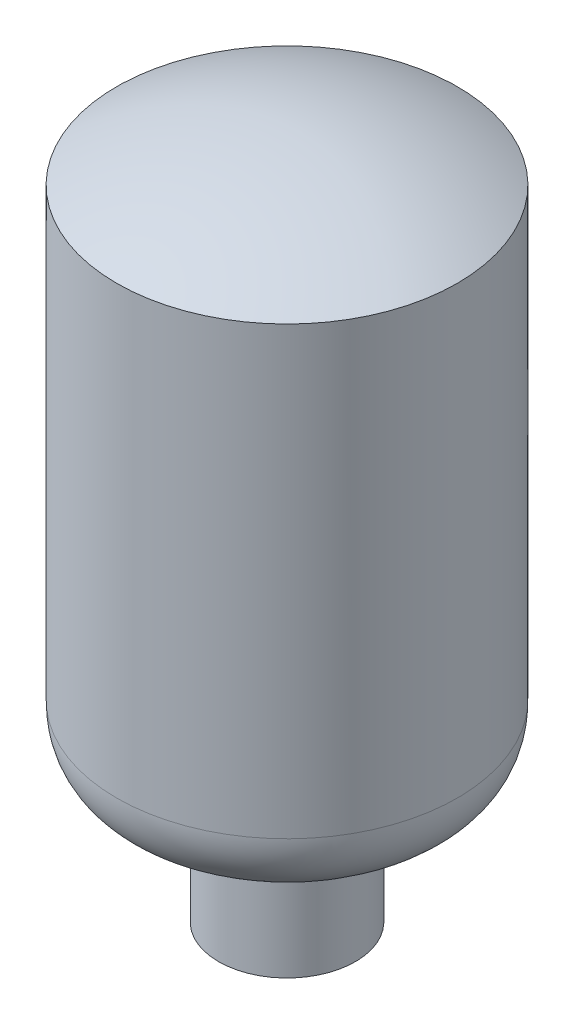
ISO-10303-21;
HEADER;
FILE_DESCRIPTION(('STEP AP214'),'2;1');
FILE_NAME('part.step','',(''),(''),'','','');
FILE_SCHEMA(('AUTOMOTIVE_DESIGN { 1 0 10303 214 1 1 1 1 }'));
ENDSEC;
DATA;
#1=APPLICATION_CONTEXT('core data for automotive mechanical design processes');
#2=APPLICATION_PROTOCOL_DEFINITION('international standard','automotive_design',2000,#1);
#3=PRODUCT_CONTEXT('',#1,'mechanical');
#4=PRODUCT('Part','Part','',(#3));
#5=PRODUCT_RELATED_PRODUCT_CATEGORY('part','',(#4));
#6=PRODUCT_DEFINITION_FORMATION('','',#4);
#7=PRODUCT_DEFINITION_CONTEXT('part definition',#1,'design');
#8=PRODUCT_DEFINITION('design','',#6,#7);
#9=PRODUCT_DEFINITION_SHAPE('','',#8);
#10=(LENGTH_UNIT() NAMED_UNIT(*) SI_UNIT(.MILLI.,.METRE.));
#11=(NAMED_UNIT(*) PLANE_ANGLE_UNIT() SI_UNIT($,.RADIAN.));
#12=(NAMED_UNIT(*) SI_UNIT($,.STERADIAN.) SOLID_ANGLE_UNIT());
#13=UNCERTAINTY_MEASURE_WITH_UNIT(LENGTH_MEASURE(1.E-05),#10,'distance_accuracy_value','');
#14=(GEOMETRIC_REPRESENTATION_CONTEXT(3) GLOBAL_UNCERTAINTY_ASSIGNED_CONTEXT((#13)) GLOBAL_UNIT_ASSIGNED_CONTEXT((#10,
#11,#12)) REPRESENTATION_CONTEXT('',''));
#15=CARTESIAN_POINT('',(0.,0.,0.));
#16=DIRECTION('',(0.,0.,1.));
#17=DIRECTION('',(1.,0.,0.));
#18=AXIS2_PLACEMENT_3D('',#15,#16,#17);
#19=CARTESIAN_POINT('',(0.,28.,0.));
#20=DIRECTION('',(0.,-1.,0.));
#21=DIRECTION('',(0.,0.,-1.));
#22=AXIS2_PLACEMENT_3D('',#19,#20,#21);
#23=CYLINDRICAL_SURFACE('',#22,21.5);
#24=CARTESIAN_POINT('',(0.,28.,0.));
#25=DIRECTION('',(0.,1.,0.));
#26=DIRECTION('',(0.,0.,1.));
#27=AXIS2_PLACEMENT_3D('',#24,#25,#26);
#28=CIRCLE('',#27,21.5);
#29=CARTESIAN_POINT('',(0.,28.,21.5));
#30=VERTEX_POINT('',#29);
#31=EDGE_CURVE('E11',#30,#30,#28,.T.);
#32=ORIENTED_EDGE('',*,*,#31,.F.);
#33=EDGE_LOOP('',(#32));
#34=FACE_BOUND('',#33,.T.);
#35=CARTESIAN_POINT('',(0.,0.,0.));
#36=DIRECTION('',(0.,1.,0.));
#37=DIRECTION('',(0.,0.,1.));
#38=AXIS2_PLACEMENT_3D('',#35,#36,#37);
#39=CIRCLE('',#38,21.5);
#40=CARTESIAN_POINT('',(0.,0.,21.5));
#41=VERTEX_POINT('',#40);
#42=EDGE_CURVE('E45',#41,#41,#39,.T.);
#43=ORIENTED_EDGE('',*,*,#42,.T.);
#44=EDGE_LOOP('',(#43));
#45=FACE_BOUND('',#44,.T.);
#46=ADVANCED_FACE('F42',(#34,#45),#23,.T.);
#47=CARTESIAN_POINT('',(0.,0.,0.));
#48=DIRECTION('',(0.,1.,0.));
#49=DIRECTION('',(0.,0.,1.));
#50=AXIS2_PLACEMENT_3D('',#47,#48,#49);
#51=PLANE('',#50);
#52=CARTESIAN_POINT('',(0.,0.,0.));
#53=DIRECTION('',(0.,1.,0.));
#54=DIRECTION('',(0.,0.,1.));
#55=AXIS2_PLACEMENT_3D('',#52,#53,#54);
#56=CIRCLE('',#55,20.);
#57=CARTESIAN_POINT('',(0.,0.,20.));
#58=VERTEX_POINT('',#57);
#59=EDGE_CURVE('E71',#58,#58,#56,.T.);
#60=ORIENTED_EDGE('',*,*,#59,.T.);
#61=EDGE_LOOP('',(#60));
#62=FACE_BOUND('',#61,.T.);
#63=ORIENTED_EDGE('',*,*,#42,.F.);
#64=EDGE_LOOP('',(#63));
#65=FACE_BOUND('',#64,.T.);
#66=ADVANCED_FACE('F139',(#62,#65),#51,.F.);
#67=CARTESIAN_POINT('',(0.,28.,0.));
#68=DIRECTION('',(0.,1.,0.));
#69=DIRECTION('',(0.,0.,1.));
#70=AXIS2_PLACEMENT_3D('',#67,#68,#69);
#71=CONICAL_SURFACE('',#70,21.5,0.722734247813415);
#72=CARTESIAN_POINT('',(0.,34.,0.));
#73=DIRECTION('',(0.,1.,0.));
#74=DIRECTION('',(0.,0.,1.));
#75=AXIS2_PLACEMENT_3D('',#72,#73,#74);
#76=CIRCLE('',#75,26.7915026221292);
#77=CARTESIAN_POINT('',(0.,34.,26.7915026221292));
#78=VERTEX_POINT('',#77);
#79=EDGE_CURVE('E131',#78,#78,#76,.T.);
#80=ORIENTED_EDGE('',*,*,#79,.F.);
#81=EDGE_LOOP('',(#80));
#82=FACE_BOUND('',#81,.T.);
#83=ORIENTED_EDGE('',*,*,#31,.T.);
#84=EDGE_LOOP('',(#83));
#85=FACE_BOUND('',#84,.T.);
#86=ADVANCED_FACE('F94',(#82,#85),#71,.T.);
#87=CARTESIAN_POINT('',(26.3509179910604,33.883645720053,0.));
#88=CARTESIAN_POINT('',(26.5712103065948,33.9418228600265,0.));
#89=CARTESIAN_POINT('',(26.7915026221292,34.,0.));
#90=CARTESIAN_POINT('',(31.5,35.2434701153906,0.));
#91=CARTESIAN_POINT('',(31.5,38.5,0.));
#92=CARTESIAN_POINT('',(31.5,39.2508613442087,0.));
#93=CARTESIAN_POINT('',(31.5,40.0017226884173,0.));
#94=B_SPLINE_CURVE_WITH_KNOTS('',2,(#87,#88,#89,#90,#91,#92,#93),.UNSPECIFIED.,.F.,.F.,(3,2,2,
3),(-0.046786118342066,0.,1.,1.23057099760002),.UNSPECIFIED.);
#95=CARTESIAN_POINT('',(0.,200.5,0.));
#96=DIRECTION('',(0.,1.,0.));
#97=AXIS1_PLACEMENT('',#95,#96);
#98=SURFACE_OF_REVOLUTION('',#94,#97);
#99=CARTESIAN_POINT('',(0.,38.5,0.));
#100=DIRECTION('',(0.,1.,0.));
#101=DIRECTION('',(0.,0.,1.));
#102=AXIS2_PLACEMENT_3D('',#99,#100,#101);
#103=CIRCLE('',#102,31.5);
#104=CARTESIAN_POINT('',(0.,38.5,31.5));
#105=VERTEX_POINT('',#104);
#106=EDGE_CURVE('E128',#105,#105,#103,.T.);
#107=ORIENTED_EDGE('',*,*,#106,.F.);
#108=EDGE_LOOP('',(#107));
#109=FACE_BOUND('',#108,.T.);
#110=ORIENTED_EDGE('',*,*,#79,.T.);
#111=EDGE_LOOP('',(#110));
#112=FACE_BOUND('',#111,.T.);
#113=ADVANCED_FACE('F88',(#109,#112),#98,.T.);
#114=CARTESIAN_POINT('',(29.9982783008005,38.5017236765004,0.));
#115=CARTESIAN_POINT('',(30.4988522005336,38.5011491176669,0.));
#116=CARTESIAN_POINT('',(30.9994261002668,38.5005745588335,0.));
#117=CARTESIAN_POINT('',(31.5,38.5,0.));
#118=CARTESIAN_POINT('',(41.8708926258628,38.4880962871371,0.));
#119=CARTESIAN_POINT('',(53.5,45.2057493483189,0.));
#120=CARTESIAN_POINT('',(53.5,60.5,0.));
#121=B_SPLINE_CURVE_WITH_KNOTS('',3,(#114,#115,#116,#117,#118,#119,#120),.UNSPECIFIED.,.F.,.F.,
(4,3,4),(-0.0482671952928001,0.,1.),.UNSPECIFIED.);
#122=CARTESIAN_POINT('',(0.,200.5,0.));
#123=DIRECTION('',(0.,1.,0.));
#124=AXIS1_PLACEMENT('',#122,#123);
#125=SURFACE_OF_REVOLUTION('',#121,#124);
#126=CARTESIAN_POINT('',(0.,60.5,0.));
#127=DIRECTION('',(0.,1.,0.));
#128=DIRECTION('',(0.,0.,1.));
#129=AXIS2_PLACEMENT_3D('',#126,#127,#128);
#130=CIRCLE('',#129,53.5);
#131=CARTESIAN_POINT('',(0.,60.5,53.5));
#132=VERTEX_POINT('',#131);
#133=EDGE_CURVE('E125',#132,#132,#130,.T.);
#134=ORIENTED_EDGE('',*,*,#133,.F.);
#135=EDGE_LOOP('',(#134));
#136=FACE_BOUND('',#135,.T.);
#137=ORIENTED_EDGE('',*,*,#106,.T.);
#138=EDGE_LOOP('',(#137));
#139=FACE_BOUND('',#138,.T.);
#140=ADVANCED_FACE('F93',(#136,#139),#125,.T.);
#141=CARTESIAN_POINT('',(0.,200.5,0.));
#142=DIRECTION('',(0.,1.,0.));
#143=DIRECTION('',(0.,0.,1.));
#144=AXIS2_PLACEMENT_3D('',#141,#142,#143);
#145=CYLINDRICAL_SURFACE('',#144,53.5);
#146=CARTESIAN_POINT('',(0.,200.5,0.));
#147=DIRECTION('',(0.,1.,0.));
#148=DIRECTION('',(0.,0.,1.));
#149=AXIS2_PLACEMENT_3D('',#146,#147,#148);
#150=CIRCLE('',#149,53.5);
#151=CARTESIAN_POINT('',(0.,200.5,53.5));
#152=VERTEX_POINT('',#151);
#153=EDGE_CURVE('E119',#152,#152,#150,.T.);
#154=ORIENTED_EDGE('',*,*,#153,.F.);
#155=EDGE_LOOP('',(#154));
#156=FACE_BOUND('',#155,.T.);
#157=ORIENTED_EDGE('',*,*,#133,.T.);
#158=EDGE_LOOP('',(#157));
#159=FACE_BOUND('',#158,.T.);
#160=ADVANCED_FACE('F105',(#156,#159),#145,.T.);
#161=CARTESIAN_POINT('',(53.5,200.5,0.));
#162=CARTESIAN_POINT('',(27.6507233178447,214.5,0.));
#163=CARTESIAN_POINT('',(0.,214.5,0.));
#164=B_SPLINE_CURVE_WITH_KNOTS('',2,(#161,#162,#163),.UNSPECIFIED.,.F.,.F.,(3,3),(0.,1.),.UNSPECIFIED.);
#165=CARTESIAN_POINT('',(0.,214.5,0.));
#166=DIRECTION('',(0.,1.,0.));
#167=AXIS1_PLACEMENT('',#165,#166);
#168=SURFACE_OF_REVOLUTION('',#164,#167);
#169=CARTESIAN_POINT('',(0.,214.5,0.));
#170=VERTEX_POINT('',#169);
#171=VERTEX_LOOP('',#170);
#172=FACE_BOUND('',#171,.T.);
#173=ORIENTED_EDGE('',*,*,#153,.T.);
#174=EDGE_LOOP('',(#173));
#175=FACE_BOUND('',#174,.T.);
#176=ADVANCED_FACE('F109',(#172,#175),#168,.T.);
#177=CARTESIAN_POINT('',(0.,28.,0.));
#178=DIRECTION('',(0.,-1.,0.));
#179=DIRECTION('',(0.,0.,-1.));
#180=AXIS2_PLACEMENT_3D('',#177,#178,#179);
#181=CYLINDRICAL_SURFACE('',#180,20.);
#182=CARTESIAN_POINT('',(0.,28.5669467095138,0.));
#183=DIRECTION('',(0.,1.,0.));
#184=DIRECTION('',(0.,0.,1.));
#185=AXIS2_PLACEMENT_3D('',#182,#183,#184);
#186=CIRCLE('',#185,20.);
#187=CARTESIAN_POINT('',(0.,28.5669467095138,20.));
#188=VERTEX_POINT('',#187);
#189=EDGE_CURVE('E74',#188,#188,#186,.T.);
#190=ORIENTED_EDGE('',*,*,#189,.T.);
#191=EDGE_LOOP('',(#190));
#192=FACE_BOUND('',#191,.T.);
#193=ORIENTED_EDGE('',*,*,#59,.F.);
#194=EDGE_LOOP('',(#193));
#195=FACE_BOUND('',#194,.T.);
#196=ADVANCED_FACE('F113',(#192,#195),#181,.F.);
#197=CARTESIAN_POINT('',(0.,28.9921567416492,0.));
#198=DIRECTION('',(0.,1.,0.));
#199=DIRECTION('',(0.,0.,1.));
#200=AXIS2_PLACEMENT_3D('',#197,#198,#199);
#201=CONICAL_SURFACE('',#200,20.375,0.722734247813415);
#202=CARTESIAN_POINT('',(0.,35.3339240437317,0.));
#203=DIRECTION('',(0.,1.,0.));
#204=DIRECTION('',(0.,0.,1.));
#205=AXIS2_PLACEMENT_3D('',#202,#203,#204);
#206=CIRCLE('',#205,25.9679130513171);
#207=CARTESIAN_POINT('',(0.,35.3339240437317,25.9679130513171));
#208=VERTEX_POINT('',#207);
#209=EDGE_CURVE('E75',#208,#208,#206,.T.);
#210=ORIENTED_EDGE('',*,*,#209,.T.);
#211=EDGE_LOOP('',(#210));
#212=FACE_BOUND('',#211,.T.);
#213=ORIENTED_EDGE('',*,*,#189,.F.);
#214=EDGE_LOOP('',(#213));
#215=FACE_BOUND('',#214,.T.);
#216=ADVANCED_FACE('F151',(#212,#215),#201,.F.);
#217=CARTESIAN_POINT('',(26.3509179910604,33.883645720053,0.));
#218=CARTESIAN_POINT('',(26.5712103065948,33.9418228600265,0.));
#219=CARTESIAN_POINT('',(31.5,35.2434701153906,0.));
#220=CARTESIAN_POINT('',(31.5,39.2508613442087,0.));
#221=CARTESIAN_POINT('',(31.5,40.0017226884173,0.));
#222=B_SPLINE_CURVE_WITH_KNOTS('',2,(#217,#218,#219,#220,#221),.UNSPECIFIED.,.F.,.F.,(3,1,1,3),
(-0.046786118342066,0.,1.,1.23057099760002),.UNSPECIFIED.);
#223=CARTESIAN_POINT('',(0.,200.5,0.));
#224=DIRECTION('',(0.,1.,0.));
#225=AXIS1_PLACEMENT('',#223,#224);
#226=SURFACE_OF_REVOLUTION('',#222,#225);
#227=OFFSET_SURFACE('',#226,-1.5,.F.);
#228=CARTESIAN_POINT('',(0.,40.0017226884173,0.));
#229=DIRECTION('',(0.,1.,0.));
#230=DIRECTION('',(0.,0.,1.));
#231=AXIS2_PLACEMENT_3D('',#228,#229,#230);
#232=CIRCLE('',#231,30.);
#233=CARTESIAN_POINT('',(0.,40.0017226884173,30.));
#234=VERTEX_POINT('',#233);
#235=EDGE_CURVE('E67',#234,#234,#232,.T.);
#236=ORIENTED_EDGE('',*,*,#235,.T.);
#237=EDGE_LOOP('',(#236));
#238=FACE_BOUND('',#237,.T.);
#239=ORIENTED_EDGE('',*,*,#209,.F.);
#240=EDGE_LOOP('',(#239));
#241=FACE_BOUND('',#240,.T.);
#242=ADVANCED_FACE('F96',(#238,#241),#227,.F.);
#243=CARTESIAN_POINT('',(29.9982783008005,38.5017236765004,0.));
#244=CARTESIAN_POINT('',(30.4988522005336,38.5011491176669,0.));
#245=CARTESIAN_POINT('',(30.9994261002668,38.5005745588335,0.));
#246=CARTESIAN_POINT('',(41.8708926258628,38.4880962871371,0.));
#247=CARTESIAN_POINT('',(53.5,45.2057493483189,0.));
#248=CARTESIAN_POINT('',(53.5,60.5,0.));
#249=B_SPLINE_CURVE_WITH_KNOTS('',3,(#243,#244,#245,#246,#247,#248),.UNSPECIFIED.,.F.,.F.,(4,2,
4),(-0.0482671952928001,0.,1.),.UNSPECIFIED.);
#250=CARTESIAN_POINT('',(0.,200.5,0.));
#251=DIRECTION('',(0.,1.,0.));
#252=AXIS1_PLACEMENT('',#250,#251);
#253=SURFACE_OF_REVOLUTION('',#249,#252);
#254=OFFSET_SURFACE('',#253,-1.5,.F.);
#255=CARTESIAN_POINT('',(0.,60.5,0.));
#256=DIRECTION('',(0.,1.,0.));
#257=DIRECTION('',(0.,0.,1.));
#258=AXIS2_PLACEMENT_3D('',#255,#256,#257);
#259=CIRCLE('',#258,52.);
#260=CARTESIAN_POINT('',(0.,60.5,52.));
#261=VERTEX_POINT('',#260);
#262=EDGE_CURVE('E64',#261,#261,#259,.T.);
#263=ORIENTED_EDGE('',*,*,#262,.T.);
#264=EDGE_LOOP('',(#263));
#265=FACE_BOUND('',#264,.T.);
#266=ORIENTED_EDGE('',*,*,#235,.F.);
#267=EDGE_LOOP('',(#266));
#268=FACE_BOUND('',#267,.T.);
#269=ADVANCED_FACE('F98',(#265,#268),#254,.F.);
#270=CARTESIAN_POINT('',(0.,200.5,0.));
#271=DIRECTION('',(0.,1.,0.));
#272=DIRECTION('',(0.,0.,1.));
#273=AXIS2_PLACEMENT_3D('',#270,#271,#272);
#274=CYLINDRICAL_SURFACE('',#273,52.);
#275=CARTESIAN_POINT('',(0.,199.603035809467,0.));
#276=DIRECTION('',(0.,1.,0.));
#277=DIRECTION('',(0.,0.,1.));
#278=AXIS2_PLACEMENT_3D('',#275,#276,#277);
#279=CIRCLE('',#278,52.);
#280=CARTESIAN_POINT('',(0.,199.603035809467,52.));
#281=VERTEX_POINT('',#280);
#282=EDGE_CURVE('E62',#281,#281,#279,.T.);
#283=ORIENTED_EDGE('',*,*,#282,.T.);
#284=EDGE_LOOP('',(#283));
#285=FACE_BOUND('',#284,.T.);
#286=ORIENTED_EDGE('',*,*,#262,.F.);
#287=EDGE_LOOP('',(#286));
#288=FACE_BOUND('',#287,.T.);
#289=ADVANCED_FACE('F58',(#285,#288),#274,.F.);
#290=CARTESIAN_POINT('',(53.5,200.5,0.));
#291=CARTESIAN_POINT('',(27.6507233178447,214.5,0.));
#292=CARTESIAN_POINT('',(0.,214.5,0.));
#293=B_SPLINE_CURVE_WITH_KNOTS('',2,(#290,#291,#292),.UNSPECIFIED.,.F.,.F.,(3,3),(0.,1.),.UNSPECIFIED.);
#294=CARTESIAN_POINT('',(0.,214.5,0.));
#295=DIRECTION('',(0.,1.,0.));
#296=AXIS1_PLACEMENT('',#294,#295);
#297=SURFACE_OF_REVOLUTION('',#293,#296);
#298=OFFSET_SURFACE('',#297,-1.5,.F.);
#299=CARTESIAN_POINT('',(0.,213.,0.));
#300=VERTEX_POINT('',#299);
#301=VERTEX_LOOP('',#300);
#302=FACE_BOUND('',#301,.T.);
#303=ORIENTED_EDGE('',*,*,#282,.F.);
#304=EDGE_LOOP('',(#303));
#305=FACE_BOUND('',#304,.T.);
#306=ADVANCED_FACE('F55',(#302,#305),#298,.F.);
#307=CLOSED_SHELL('',(#46,#66,#86,#113,#140,#160,#176,#196,#216,#242,#269,#289,#306));
#308=MANIFOLD_SOLID_BREP('B2',#307);
#309=ADVANCED_BREP_SHAPE_REPRESENTATION('',(#18,#308),#14);
#310=SHAPE_DEFINITION_REPRESENTATION(#9,#309);
ENDSEC;
END-ISO-10303-21;
